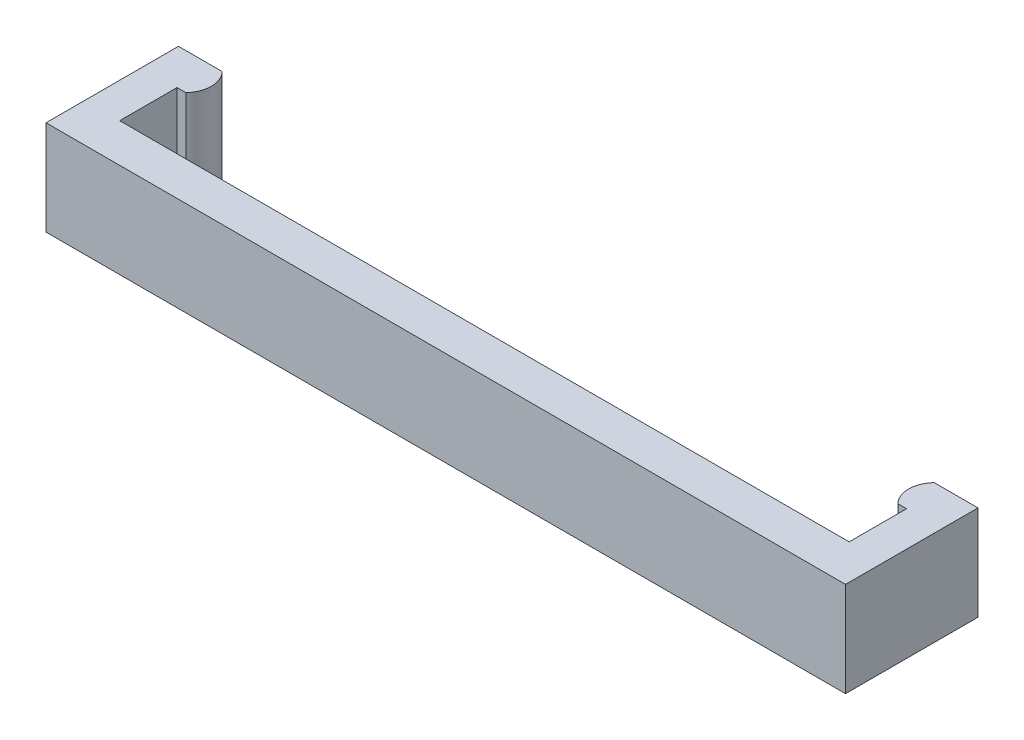
ISO-10303-21;
HEADER;
FILE_DESCRIPTION(('STEP AP214'),'2;1');
FILE_NAME('part.step','',(''),(''),'','','');
FILE_SCHEMA(('AUTOMOTIVE_DESIGN { 1 0 10303 214 1 1 1 1 }'));
ENDSEC;
DATA;
#1=APPLICATION_CONTEXT('core data for automotive mechanical design processes');
#2=APPLICATION_PROTOCOL_DEFINITION('international standard','automotive_design',2000,#1);
#3=PRODUCT_CONTEXT('',#1,'mechanical');
#4=PRODUCT('Part','Part','',(#3));
#5=PRODUCT_RELATED_PRODUCT_CATEGORY('part','',(#4));
#6=PRODUCT_DEFINITION_FORMATION('','',#4);
#7=PRODUCT_DEFINITION_CONTEXT('part definition',#1,'design');
#8=PRODUCT_DEFINITION('design','',#6,#7);
#9=PRODUCT_DEFINITION_SHAPE('','',#8);
#10=(LENGTH_UNIT() NAMED_UNIT(*) SI_UNIT(.MILLI.,.METRE.));
#11=(NAMED_UNIT(*) PLANE_ANGLE_UNIT() SI_UNIT($,.RADIAN.));
#12=(NAMED_UNIT(*) SI_UNIT($,.STERADIAN.) SOLID_ANGLE_UNIT());
#13=UNCERTAINTY_MEASURE_WITH_UNIT(LENGTH_MEASURE(1.E-05),#10,'distance_accuracy_value','');
#14=(GEOMETRIC_REPRESENTATION_CONTEXT(3) GLOBAL_UNCERTAINTY_ASSIGNED_CONTEXT((#13)) GLOBAL_UNIT_ASSIGNED_CONTEXT((#10,
#11,#12)) REPRESENTATION_CONTEXT('',''));
#15=CARTESIAN_POINT('',(0.,0.,0.));
#16=DIRECTION('',(0.,0.,1.));
#17=DIRECTION('',(1.,0.,0.));
#18=AXIS2_PLACEMENT_3D('',#15,#16,#17);
#19=CARTESIAN_POINT('',(-13.94,-62.0371547426149,29.43));
#20=DIRECTION('',(0.,0.,1.));
#21=DIRECTION('',(1.,0.,0.));
#22=AXIS2_PLACEMENT_3D('',#19,#20,#21);
#23=PLANE('',#22);
#24=DIRECTION('',(1.,0.,0.));
#25=VECTOR('',#24,1.);
#26=CARTESIAN_POINT('',(-13.94,0.,29.43));
#27=LINE('',#26,#25);
#28=CARTESIAN_POINT('',(-13.94,0.,29.43));
#29=VERTEX_POINT('',#28);
#30=CARTESIAN_POINT('',(-10.94,0.,29.43));
#31=VERTEX_POINT('',#30);
#32=EDGE_CURVE('E139',#29,#31,#27,.T.);
#33=ORIENTED_EDGE('',*,*,#32,.T.);
#34=DIRECTION('',(0.,1.,0.));
#35=VECTOR('',#34,1.);
#36=CARTESIAN_POINT('',(-10.94,-6.49,29.43));
#37=LINE('',#36,#35);
#38=CARTESIAN_POINT('',(-10.94,-6.49,29.43));
#39=VERTEX_POINT('',#38);
#40=EDGE_CURVE('E137',#39,#31,#37,.T.);
#41=ORIENTED_EDGE('',*,*,#40,.F.);
#42=DIRECTION('',(-1.,0.,0.));
#43=VECTOR('',#42,1.);
#44=CARTESIAN_POINT('',(-13.94,-6.49,29.43));
#45=LINE('',#44,#43);
#46=CARTESIAN_POINT('',(-13.94,-6.49,29.43));
#47=VERTEX_POINT('',#46);
#48=EDGE_CURVE('E125',#39,#47,#45,.T.);
#49=ORIENTED_EDGE('',*,*,#48,.T.);
#50=DIRECTION('',(0.,1.,0.));
#51=VECTOR('',#50,1.);
#52=CARTESIAN_POINT('',(-13.94,-62.0371547426149,29.43));
#53=LINE('',#52,#51);
#54=EDGE_CURVE('E213',#47,#29,#53,.T.);
#55=ORIENTED_EDGE('',*,*,#54,.T.);
#56=EDGE_LOOP('',(#33,#41,#49,#55));
#57=FACE_BOUND('',#56,.T.);
#58=ADVANCED_FACE('F33',(#57),#23,.F.);
#59=CARTESIAN_POINT('',(0.,0.,0.));
#60=DIRECTION('',(0.,1.,0.));
#61=DIRECTION('',(0.,0.,1.));
#62=AXIS2_PLACEMENT_3D('',#59,#60,#61);
#63=PLANE('',#62);
#64=DIRECTION('',(0.,0.,1.));
#65=VECTOR('',#64,1.);
#66=CARTESIAN_POINT('',(-11.54,0.,29.43));
#67=LINE('',#66,#65);
#68=CARTESIAN_POINT('',(-11.54,0.,31.93));
#69=VERTEX_POINT('',#68);
#70=CARTESIAN_POINT('',(-11.54,0.,35.86));
#71=VERTEX_POINT('',#70);
#72=EDGE_CURVE('E172',#69,#71,#67,.T.);
#73=ORIENTED_EDGE('',*,*,#72,.F.);
#74=DIRECTION('',(1.,0.,0.));
#75=VECTOR('',#74,1.);
#76=CARTESIAN_POINT('',(-10.94,0.,31.93));
#77=LINE('',#76,#75);
#78=CARTESIAN_POINT('',(-10.94,0.,31.93));
#79=VERTEX_POINT('',#78);
#80=EDGE_CURVE('E148',#69,#79,#77,.T.);
#81=ORIENTED_EDGE('',*,*,#80,.T.);
#82=CARTESIAN_POINT('',(-12.2525,0.,30.68));
#83=DIRECTION('',(0.,1.,0.));
#84=DIRECTION('',(0.,0.,-1.));
#85=AXIS2_PLACEMENT_3D('',#82,#83,#84);
#86=CIRCLE('',#85,1.81250000000003);
#87=EDGE_CURVE('E152',#79,#31,#86,.T.);
#88=ORIENTED_EDGE('',*,*,#87,.T.);
#89=ORIENTED_EDGE('',*,*,#32,.F.);
#90=DIRECTION('',(0.,0.,-1.));
#91=VECTOR('',#90,1.);
#92=CARTESIAN_POINT('',(-13.94,0.,29.43));
#93=LINE('',#92,#91);
#94=CARTESIAN_POINT('',(-13.94,0.,38.51));
#95=VERTEX_POINT('',#94);
#96=EDGE_CURVE('E192',#95,#29,#93,.T.);
#97=ORIENTED_EDGE('',*,*,#96,.F.);
#98=DIRECTION('',(-1.,0.,0.));
#99=VECTOR('',#98,1.);
#100=CARTESIAN_POINT('',(-13.94,0.,38.51));
#101=LINE('',#100,#99);
#102=CARTESIAN_POINT('',(40.86,0.,38.51));
#103=VERTEX_POINT('',#102);
#104=EDGE_CURVE('E204',#103,#95,#101,.T.);
#105=ORIENTED_EDGE('',*,*,#104,.F.);
#106=DIRECTION('',(0.,0.,1.));
#107=VECTOR('',#106,1.);
#108=CARTESIAN_POINT('',(40.86,0.,29.43));
#109=LINE('',#108,#107);
#110=CARTESIAN_POINT('',(40.86,0.,29.43));
#111=VERTEX_POINT('',#110);
#112=EDGE_CURVE('E201',#111,#103,#109,.T.);
#113=ORIENTED_EDGE('',*,*,#112,.F.);
#114=CARTESIAN_POINT('',(37.86,0.,29.43));
#115=VERTEX_POINT('',#114);
#116=EDGE_CURVE('E199',#115,#111,#27,.T.);
#117=ORIENTED_EDGE('',*,*,#116,.F.);
#118=CARTESIAN_POINT('',(39.1725,0.,30.68));
#119=DIRECTION('',(0.,1.,0.));
#120=DIRECTION('',(0.,0.,1.));
#121=AXIS2_PLACEMENT_3D('',#118,#119,#120);
#122=CIRCLE('',#121,1.81250000000003);
#123=CARTESIAN_POINT('',(37.86,0.,31.93));
#124=VERTEX_POINT('',#123);
#125=EDGE_CURVE('E157',#115,#124,#122,.T.);
#126=ORIENTED_EDGE('',*,*,#125,.T.);
#127=DIRECTION('',(1.,0.,0.));
#128=VECTOR('',#127,1.);
#129=CARTESIAN_POINT('',(37.86,0.,31.93));
#130=LINE('',#129,#128);
#131=CARTESIAN_POINT('',(38.46,0.,31.93));
#132=VERTEX_POINT('',#131);
#133=EDGE_CURVE('E163',#124,#132,#130,.T.);
#134=ORIENTED_EDGE('',*,*,#133,.T.);
#135=DIRECTION('',(0.,0.,-1.));
#136=VECTOR('',#135,1.);
#137=CARTESIAN_POINT('',(38.46,0.,29.43));
#138=LINE('',#137,#136);
#139=CARTESIAN_POINT('',(38.46,0.,35.86));
#140=VERTEX_POINT('',#139);
#141=EDGE_CURVE('E179',#140,#132,#138,.T.);
#142=ORIENTED_EDGE('',*,*,#141,.F.);
#143=DIRECTION('',(1.,0.,0.));
#144=VECTOR('',#143,1.);
#145=CARTESIAN_POINT('',(-11.54,0.,35.86));
#146=LINE('',#145,#144);
#147=EDGE_CURVE('E186',#71,#140,#146,.T.);
#148=ORIENTED_EDGE('',*,*,#147,.F.);
#149=EDGE_LOOP('',(#73,#81,#88,#89,#97,#105,#113,#117,#126,#134,#142,#148));
#150=FACE_BOUND('',#149,.T.);
#151=ADVANCED_FACE('F223',(#150),#63,.T.);
#152=CARTESIAN_POINT('',(-13.94,-62.0371547426149,38.51));
#153=DIRECTION('',(0.,0.,-1.));
#154=DIRECTION('',(-1.,0.,0.));
#155=AXIS2_PLACEMENT_3D('',#152,#153,#154);
#156=PLANE('',#155);
#157=DIRECTION('',(0.,1.,0.));
#158=VECTOR('',#157,1.);
#159=CARTESIAN_POINT('',(-13.94,-62.0371547426149,38.51));
#160=LINE('',#159,#158);
#161=CARTESIAN_POINT('',(-13.94,-6.49,38.51));
#162=VERTEX_POINT('',#161);
#163=EDGE_CURVE('E207',#162,#95,#160,.T.);
#164=ORIENTED_EDGE('',*,*,#163,.F.);
#165=DIRECTION('',(1.,0.,0.));
#166=VECTOR('',#165,1.);
#167=CARTESIAN_POINT('',(-13.94,-6.49,38.51));
#168=LINE('',#167,#166);
#169=CARTESIAN_POINT('',(40.86,-6.49,38.51));
#170=VERTEX_POINT('',#169);
#171=EDGE_CURVE('E37',#162,#170,#168,.T.);
#172=ORIENTED_EDGE('',*,*,#171,.T.);
#173=DIRECTION('',(0.,1.,0.));
#174=VECTOR('',#173,1.);
#175=CARTESIAN_POINT('',(40.86,-62.0371547426149,38.51));
#176=LINE('',#175,#174);
#177=EDGE_CURVE('E209',#170,#103,#176,.T.);
#178=ORIENTED_EDGE('',*,*,#177,.T.);
#179=ORIENTED_EDGE('',*,*,#104,.T.);
#180=EDGE_LOOP('',(#164,#172,#178,#179));
#181=FACE_BOUND('',#180,.T.);
#182=ADVANCED_FACE('F217',(#181),#156,.F.);
#183=CARTESIAN_POINT('',(40.86,-62.0371547426149,29.43));
#184=DIRECTION('',(-1.,0.,0.));
#185=DIRECTION('',(0.,0.,1.));
#186=AXIS2_PLACEMENT_3D('',#183,#184,#185);
#187=PLANE('',#186);
#188=ORIENTED_EDGE('',*,*,#177,.F.);
#189=DIRECTION('',(0.,0.,-1.));
#190=VECTOR('',#189,1.);
#191=CARTESIAN_POINT('',(40.86,-6.49,29.43));
#192=LINE('',#191,#190);
#193=CARTESIAN_POINT('',(40.86,-6.49,29.43));
#194=VERTEX_POINT('',#193);
#195=EDGE_CURVE('E134',#170,#194,#192,.T.);
#196=ORIENTED_EDGE('',*,*,#195,.T.);
#197=DIRECTION('',(0.,1.,0.));
#198=VECTOR('',#197,1.);
#199=CARTESIAN_POINT('',(40.86,-62.0371547426149,29.43));
#200=LINE('',#199,#198);
#201=EDGE_CURVE('E211',#194,#111,#200,.T.);
#202=ORIENTED_EDGE('',*,*,#201,.T.);
#203=ORIENTED_EDGE('',*,*,#112,.T.);
#204=EDGE_LOOP('',(#188,#196,#202,#203));
#205=FACE_BOUND('',#204,.T.);
#206=ADVANCED_FACE('F249',(#205),#187,.F.);
#207=CARTESIAN_POINT('',(37.86,-6.49,29.43));
#208=VERTEX_POINT('',#207);
#209=EDGE_CURVE('E42',#194,#208,#45,.T.);
#210=ORIENTED_EDGE('',*,*,#209,.T.);
#211=DIRECTION('',(0.,1.,0.));
#212=VECTOR('',#211,1.);
#213=CARTESIAN_POINT('',(37.86,-6.49,29.43));
#214=LINE('',#213,#212);
#215=EDGE_CURVE('E166',#208,#115,#214,.T.);
#216=ORIENTED_EDGE('',*,*,#215,.T.);
#217=ORIENTED_EDGE('',*,*,#116,.T.);
#218=ORIENTED_EDGE('',*,*,#201,.F.);
#219=EDGE_LOOP('',(#210,#216,#217,#218));
#220=FACE_BOUND('',#219,.T.);
#221=ADVANCED_FACE('F247',(#220),#23,.F.);
#222=CARTESIAN_POINT('',(-13.94,-62.0371547426149,29.43));
#223=DIRECTION('',(1.,0.,0.));
#224=DIRECTION('',(0.,0.,-1.));
#225=AXIS2_PLACEMENT_3D('',#222,#223,#224);
#226=PLANE('',#225);
#227=ORIENTED_EDGE('',*,*,#54,.F.);
#228=DIRECTION('',(0.,0.,1.));
#229=VECTOR('',#228,1.);
#230=CARTESIAN_POINT('',(-13.94,-6.49,29.43));
#231=LINE('',#230,#229);
#232=EDGE_CURVE('E11',#47,#162,#231,.T.);
#233=ORIENTED_EDGE('',*,*,#232,.T.);
#234=ORIENTED_EDGE('',*,*,#163,.T.);
#235=ORIENTED_EDGE('',*,*,#96,.T.);
#236=EDGE_LOOP('',(#227,#233,#234,#235));
#237=FACE_BOUND('',#236,.T.);
#238=ADVANCED_FACE('F35',(#237),#226,.F.);
#239=CARTESIAN_POINT('',(0.,-6.49,0.));
#240=DIRECTION('',(0.,1.,0.));
#241=DIRECTION('',(0.,0.,1.));
#242=AXIS2_PLACEMENT_3D('',#239,#240,#241);
#243=PLANE('',#242);
#244=ORIENTED_EDGE('',*,*,#48,.F.);
#245=CARTESIAN_POINT('',(-12.2525,-6.49,30.68));
#246=DIRECTION('',(0.,1.,0.));
#247=DIRECTION('',(0.,0.,-1.));
#248=AXIS2_PLACEMENT_3D('',#245,#246,#247);
#249=CIRCLE('',#248,1.81250000000003);
#250=CARTESIAN_POINT('',(-10.94,-6.49,31.93));
#251=VERTEX_POINT('',#250);
#252=EDGE_CURVE('E130',#251,#39,#249,.T.);
#253=ORIENTED_EDGE('',*,*,#252,.F.);
#254=DIRECTION('',(1.,0.,0.));
#255=VECTOR('',#254,1.);
#256=CARTESIAN_POINT('',(-10.94,-6.49,31.93));
#257=LINE('',#256,#255);
#258=CARTESIAN_POINT('',(-11.54,-6.49,31.93));
#259=VERTEX_POINT('',#258);
#260=EDGE_CURVE('E144',#259,#251,#257,.T.);
#261=ORIENTED_EDGE('',*,*,#260,.F.);
#262=DIRECTION('',(0.,0.,1.));
#263=VECTOR('',#262,1.);
#264=CARTESIAN_POINT('',(-11.54,-6.49,29.43));
#265=LINE('',#264,#263);
#266=CARTESIAN_POINT('',(-11.54,-6.49,35.86));
#267=VERTEX_POINT('',#266);
#268=EDGE_CURVE('E50',#259,#267,#265,.T.);
#269=ORIENTED_EDGE('',*,*,#268,.T.);
#270=DIRECTION('',(1.,0.,0.));
#271=VECTOR('',#270,1.);
#272=CARTESIAN_POINT('',(-11.54,-6.49,35.86));
#273=LINE('',#272,#271);
#274=CARTESIAN_POINT('',(38.46,-6.49,35.86));
#275=VERTEX_POINT('',#274);
#276=EDGE_CURVE('E178',#267,#275,#273,.T.);
#277=ORIENTED_EDGE('',*,*,#276,.T.);
#278=DIRECTION('',(0.,0.,-1.));
#279=VECTOR('',#278,1.);
#280=CARTESIAN_POINT('',(38.46,-6.49,29.43));
#281=LINE('',#280,#279);
#282=CARTESIAN_POINT('',(38.46,-6.49,31.93));
#283=VERTEX_POINT('',#282);
#284=EDGE_CURVE('E182',#275,#283,#281,.T.);
#285=ORIENTED_EDGE('',*,*,#284,.T.);
#286=DIRECTION('',(1.,0.,0.));
#287=VECTOR('',#286,1.);
#288=CARTESIAN_POINT('',(37.86,-6.49,31.93));
#289=LINE('',#288,#287);
#290=CARTESIAN_POINT('',(37.86,-6.49,31.93));
#291=VERTEX_POINT('',#290);
#292=EDGE_CURVE('E162',#291,#283,#289,.T.);
#293=ORIENTED_EDGE('',*,*,#292,.F.);
#294=CARTESIAN_POINT('',(39.1725,-6.49,30.68));
#295=DIRECTION('',(0.,1.,0.));
#296=DIRECTION('',(0.,0.,1.));
#297=AXIS2_PLACEMENT_3D('',#294,#295,#296);
#298=CIRCLE('',#297,1.81250000000003);
#299=EDGE_CURVE('E159',#208,#291,#298,.T.);
#300=ORIENTED_EDGE('',*,*,#299,.F.);
#301=ORIENTED_EDGE('',*,*,#209,.F.);
#302=ORIENTED_EDGE('',*,*,#195,.F.);
#303=ORIENTED_EDGE('',*,*,#171,.F.);
#304=ORIENTED_EDGE('',*,*,#232,.F.);
#305=EDGE_LOOP('',(#244,#253,#261,#269,#277,#285,#293,#300,#301,#302,#303,#304));
#306=FACE_BOUND('',#305,.T.);
#307=ADVANCED_FACE('F127',(#306),#243,.F.);
#308=CARTESIAN_POINT('',(-11.54,-6.49,29.43));
#309=DIRECTION('',(-1.,0.,0.));
#310=DIRECTION('',(0.,0.,1.));
#311=AXIS2_PLACEMENT_3D('',#308,#309,#310);
#312=PLANE('',#311);
#313=ORIENTED_EDGE('',*,*,#268,.F.);
#314=DIRECTION('',(0.,1.,0.));
#315=VECTOR('',#314,1.);
#316=CARTESIAN_POINT('',(-11.54,-6.49,31.93));
#317=LINE('',#316,#315);
#318=EDGE_CURVE('E143',#259,#69,#317,.T.);
#319=ORIENTED_EDGE('',*,*,#318,.T.);
#320=ORIENTED_EDGE('',*,*,#72,.T.);
#321=DIRECTION('',(0.,1.,0.));
#322=VECTOR('',#321,1.);
#323=CARTESIAN_POINT('',(-11.54,-6.49,35.86));
#324=LINE('',#323,#322);
#325=EDGE_CURVE('E184',#267,#71,#324,.T.);
#326=ORIENTED_EDGE('',*,*,#325,.F.);
#327=EDGE_LOOP('',(#313,#319,#320,#326));
#328=FACE_BOUND('',#327,.T.);
#329=ADVANCED_FACE('F230',(#328),#312,.F.);
#330=CARTESIAN_POINT('',(38.46,-6.49,29.43));
#331=DIRECTION('',(1.,0.,0.));
#332=DIRECTION('',(0.,0.,-1.));
#333=AXIS2_PLACEMENT_3D('',#330,#331,#332);
#334=PLANE('',#333);
#335=ORIENTED_EDGE('',*,*,#141,.T.);
#336=DIRECTION('',(0.,1.,0.));
#337=VECTOR('',#336,1.);
#338=CARTESIAN_POINT('',(38.46,-6.49,31.93));
#339=LINE('',#338,#337);
#340=EDGE_CURVE('E58',#283,#132,#339,.T.);
#341=ORIENTED_EDGE('',*,*,#340,.F.);
#342=ORIENTED_EDGE('',*,*,#284,.F.);
#343=DIRECTION('',(0.,1.,0.));
#344=VECTOR('',#343,1.);
#345=CARTESIAN_POINT('',(38.46,-6.49,35.86));
#346=LINE('',#345,#344);
#347=EDGE_CURVE('E190',#275,#140,#346,.T.);
#348=ORIENTED_EDGE('',*,*,#347,.T.);
#349=EDGE_LOOP('',(#335,#341,#342,#348));
#350=FACE_BOUND('',#349,.T.);
#351=ADVANCED_FACE('F235',(#350),#334,.F.);
#352=CARTESIAN_POINT('',(-11.54,-6.49,35.86));
#353=DIRECTION('',(0.,0.,1.));
#354=DIRECTION('',(1.,0.,0.));
#355=AXIS2_PLACEMENT_3D('',#352,#353,#354);
#356=PLANE('',#355);
#357=ORIENTED_EDGE('',*,*,#147,.T.);
#358=ORIENTED_EDGE('',*,*,#347,.F.);
#359=ORIENTED_EDGE('',*,*,#276,.F.);
#360=ORIENTED_EDGE('',*,*,#325,.T.);
#361=EDGE_LOOP('',(#357,#358,#359,#360));
#362=FACE_BOUND('',#361,.T.);
#363=ADVANCED_FACE('F233',(#362),#356,.F.);
#364=CARTESIAN_POINT('',(37.86,-6.49,31.93));
#365=DIRECTION('',(0.,0.,1.));
#366=DIRECTION('',(1.,0.,0.));
#367=AXIS2_PLACEMENT_3D('',#364,#365,#366);
#368=PLANE('',#367);
#369=ORIENTED_EDGE('',*,*,#133,.F.);
#370=DIRECTION('',(0.,1.,0.));
#371=VECTOR('',#370,1.);
#372=CARTESIAN_POINT('',(37.86,-6.49,31.93));
#373=LINE('',#372,#371);
#374=EDGE_CURVE('E173',#291,#124,#373,.T.);
#375=ORIENTED_EDGE('',*,*,#374,.F.);
#376=ORIENTED_EDGE('',*,*,#292,.T.);
#377=ORIENTED_EDGE('',*,*,#340,.T.);
#378=EDGE_LOOP('',(#369,#375,#376,#377));
#379=FACE_BOUND('',#378,.T.);
#380=ADVANCED_FACE('F240',(#379),#368,.T.);
#381=CARTESIAN_POINT('',(39.1725,-6.49,30.68));
#382=DIRECTION('',(0.,1.,0.));
#383=DIRECTION('',(0.,0.,1.));
#384=AXIS2_PLACEMENT_3D('',#381,#382,#383);
#385=CYLINDRICAL_SURFACE('',#384,1.81250000000003);
#386=ORIENTED_EDGE('',*,*,#125,.F.);
#387=ORIENTED_EDGE('',*,*,#215,.F.);
#388=ORIENTED_EDGE('',*,*,#299,.T.);
#389=ORIENTED_EDGE('',*,*,#374,.T.);
#390=EDGE_LOOP('',(#386,#387,#388,#389));
#391=FACE_BOUND('',#390,.T.);
#392=ADVANCED_FACE('F244',(#391),#385,.T.);
#393=CARTESIAN_POINT('',(-12.2525,-6.49,30.68));
#394=DIRECTION('',(0.,1.,0.));
#395=DIRECTION('',(0.,0.,1.));
#396=AXIS2_PLACEMENT_3D('',#393,#394,#395);
#397=CYLINDRICAL_SURFACE('',#396,1.81250000000003);
#398=ORIENTED_EDGE('',*,*,#87,.F.);
#399=DIRECTION('',(0.,1.,0.));
#400=VECTOR('',#399,1.);
#401=CARTESIAN_POINT('',(-10.94,-6.49,31.93));
#402=LINE('',#401,#400);
#403=EDGE_CURVE('E147',#251,#79,#402,.T.);
#404=ORIENTED_EDGE('',*,*,#403,.F.);
#405=ORIENTED_EDGE('',*,*,#252,.T.);
#406=ORIENTED_EDGE('',*,*,#40,.T.);
#407=EDGE_LOOP('',(#398,#404,#405,#406));
#408=FACE_BOUND('',#407,.T.);
#409=ADVANCED_FACE('F146',(#408),#397,.T.);
#410=CARTESIAN_POINT('',(-10.94,-6.49,31.93));
#411=DIRECTION('',(0.,0.,1.));
#412=DIRECTION('',(1.,0.,0.));
#413=AXIS2_PLACEMENT_3D('',#410,#411,#412);
#414=PLANE('',#413);
#415=ORIENTED_EDGE('',*,*,#80,.F.);
#416=ORIENTED_EDGE('',*,*,#318,.F.);
#417=ORIENTED_EDGE('',*,*,#260,.T.);
#418=ORIENTED_EDGE('',*,*,#403,.T.);
#419=EDGE_LOOP('',(#415,#416,#417,#418));
#420=FACE_BOUND('',#419,.T.);
#421=ADVANCED_FACE('F228',(#420),#414,.T.);
#422=CLOSED_SHELL('',(#58,#151,#182,#206,#221,#238,#307,#329,#351,#363,#380,#392,#409,#421));
#423=MANIFOLD_SOLID_BREP('B2',#422);
#424=ADVANCED_BREP_SHAPE_REPRESENTATION('',(#18,#423),#14);
#425=SHAPE_DEFINITION_REPRESENTATION(#9,#424);
ENDSEC;
END-ISO-10303-21;
